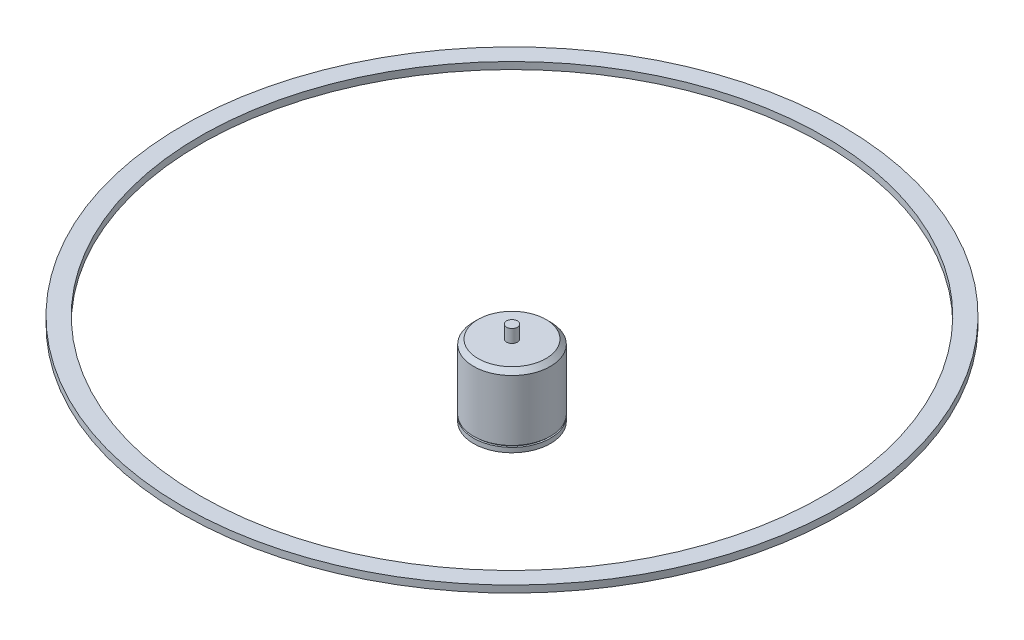
ISO-10303-21;
HEADER;
FILE_DESCRIPTION(('STEP AP214'),'2;1');
FILE_NAME('part.step','',(''),(''),'','','');
FILE_SCHEMA(('AUTOMOTIVE_DESIGN { 1 0 10303 214 1 1 1 1 }'));
ENDSEC;
DATA;
#1=APPLICATION_CONTEXT('core data for automotive mechanical design processes');
#2=APPLICATION_PROTOCOL_DEFINITION('international standard','automotive_design',2000,#1);
#3=PRODUCT_CONTEXT('',#1,'mechanical');
#4=PRODUCT('Part','Part','',(#3));
#5=PRODUCT_RELATED_PRODUCT_CATEGORY('part','',(#4));
#6=PRODUCT_DEFINITION_FORMATION('','',#4);
#7=PRODUCT_DEFINITION_CONTEXT('part definition',#1,'design');
#8=PRODUCT_DEFINITION('design','',#6,#7);
#9=PRODUCT_DEFINITION_SHAPE('','',#8);
#10=(LENGTH_UNIT() NAMED_UNIT(*) SI_UNIT(.MILLI.,.METRE.));
#11=(NAMED_UNIT(*) PLANE_ANGLE_UNIT() SI_UNIT($,.RADIAN.));
#12=(NAMED_UNIT(*) SI_UNIT($,.STERADIAN.) SOLID_ANGLE_UNIT());
#13=UNCERTAINTY_MEASURE_WITH_UNIT(LENGTH_MEASURE(1.E-05),#10,'distance_accuracy_value','');
#14=(GEOMETRIC_REPRESENTATION_CONTEXT(3) GLOBAL_UNCERTAINTY_ASSIGNED_CONTEXT((#13)) GLOBAL_UNIT_ASSIGNED_CONTEXT((#10,
#11,#12)) REPRESENTATION_CONTEXT('',''));
#15=CARTESIAN_POINT('',(0.,0.,0.));
#16=DIRECTION('',(0.,0.,1.));
#17=DIRECTION('',(1.,0.,0.));
#18=AXIS2_PLACEMENT_3D('',#15,#16,#17);
#19=CARTESIAN_POINT('',(0.,33.260506380273,0.));
#20=DIRECTION('',(0.,-1.,0.));
#21=DIRECTION('',(0.,0.,-1.));
#22=AXIS2_PLACEMENT_3D('',#19,#20,#21);
#23=CYLINDRICAL_SURFACE('',#22,113.503262110953);
#24=CARTESIAN_POINT('',(0.,33.260506380273,0.));
#25=DIRECTION('',(0.,1.,0.));
#26=DIRECTION('',(0.,0.,1.));
#27=AXIS2_PLACEMENT_3D('',#24,#25,#26);
#28=CIRCLE('',#27,113.503262110953);
#29=CARTESIAN_POINT('',(0.,33.260506380273,113.503262110953));
#30=VERTEX_POINT('',#29);
#31=EDGE_CURVE('E51',#30,#30,#28,.T.);
#32=ORIENTED_EDGE('',*,*,#31,.T.);
#33=EDGE_LOOP('',(#32));
#34=FACE_BOUND('',#33,.T.);
#35=CARTESIAN_POINT('',(0.,30.720506380273,0.));
#36=DIRECTION('',(0.,1.,0.));
#37=DIRECTION('',(0.,0.,1.));
#38=AXIS2_PLACEMENT_3D('',#35,#36,#37);
#39=CIRCLE('',#38,113.503262110953);
#40=CARTESIAN_POINT('',(0.,30.720506380273,113.503262110953));
#41=VERTEX_POINT('',#40);
#42=EDGE_CURVE('E57',#41,#41,#39,.T.);
#43=ORIENTED_EDGE('',*,*,#42,.F.);
#44=EDGE_LOOP('',(#43));
#45=FACE_BOUND('',#44,.T.);
#46=ADVANCED_FACE('F44',(#34,#45),#23,.F.);
#47=CARTESIAN_POINT('',(0.,33.260506380273,0.));
#48=DIRECTION('',(0.,-1.,0.));
#49=DIRECTION('',(0.,0.,-1.));
#50=AXIS2_PLACEMENT_3D('',#47,#48,#49);
#51=CYLINDRICAL_SURFACE('',#50,120.015);
#52=CARTESIAN_POINT('',(0.,33.260506380273,0.));
#53=DIRECTION('',(0.,1.,0.));
#54=DIRECTION('',(0.,0.,1.));
#55=AXIS2_PLACEMENT_3D('',#52,#53,#54);
#56=CIRCLE('',#55,120.015);
#57=CARTESIAN_POINT('',(0.,33.260506380273,120.015));
#58=VERTEX_POINT('',#57);
#59=EDGE_CURVE('E11',#58,#58,#56,.T.);
#60=ORIENTED_EDGE('',*,*,#59,.F.);
#61=EDGE_LOOP('',(#60));
#62=FACE_BOUND('',#61,.T.);
#63=CARTESIAN_POINT('',(0.,30.720506380273,0.));
#64=DIRECTION('',(0.,1.,0.));
#65=DIRECTION('',(0.,0.,1.));
#66=AXIS2_PLACEMENT_3D('',#63,#64,#65);
#67=CIRCLE('',#66,120.015);
#68=CARTESIAN_POINT('',(0.,30.720506380273,120.015));
#69=VERTEX_POINT('',#68);
#70=EDGE_CURVE('E47',#69,#69,#67,.T.);
#71=ORIENTED_EDGE('',*,*,#70,.T.);
#72=EDGE_LOOP('',(#71));
#73=FACE_BOUND('',#72,.T.);
#74=ADVANCED_FACE('F64',(#62,#73),#51,.T.);
#75=CARTESIAN_POINT('',(0.,33.260506380273,0.));
#76=DIRECTION('',(0.,1.,0.));
#77=DIRECTION('',(0.,0.,1.));
#78=AXIS2_PLACEMENT_3D('',#75,#76,#77);
#79=PLANE('',#78);
#80=ORIENTED_EDGE('',*,*,#31,.F.);
#81=EDGE_LOOP('',(#80));
#82=FACE_BOUND('',#81,.T.);
#83=ORIENTED_EDGE('',*,*,#59,.T.);
#84=EDGE_LOOP('',(#83));
#85=FACE_BOUND('',#84,.T.);
#86=ADVANCED_FACE('F68',(#82,#85),#79,.T.);
#87=CARTESIAN_POINT('',(0.,30.720506380273,0.));
#88=DIRECTION('',(0.,1.,0.));
#89=DIRECTION('',(0.,0.,1.));
#90=AXIS2_PLACEMENT_3D('',#87,#88,#89);
#91=PLANE('',#90);
#92=ORIENTED_EDGE('',*,*,#42,.T.);
#93=EDGE_LOOP('',(#92));
#94=FACE_BOUND('',#93,.T.);
#95=ORIENTED_EDGE('',*,*,#70,.F.);
#96=EDGE_LOOP('',(#95));
#97=FACE_BOUND('',#96,.T.);
#98=ADVANCED_FACE('F66',(#94,#97),#91,.F.);
#99=CLOSED_SHELL('',(#46,#74,#86,#98));
#100=MANIFOLD_SOLID_BREP('B2',#99);
#101=CARTESIAN_POINT('',(0.,0.,0.));
#102=DIRECTION('',(0.,1.,0.));
#103=DIRECTION('',(0.,0.,1.));
#104=AXIS2_PLACEMENT_3D('',#101,#102,#103);
#105=PLANE('',#104);
#106=CARTESIAN_POINT('',(0.,0.,0.));
#107=DIRECTION('',(0.,1.,0.));
#108=DIRECTION('',(0.,0.,1.));
#109=AXIS2_PLACEMENT_3D('',#106,#107,#108);
#110=CIRCLE('',#109,14.);
#111=CARTESIAN_POINT('',(0.,0.,14.));
#112=VERTEX_POINT('',#111);
#113=EDGE_CURVE('E43',#112,#112,#110,.T.);
#114=ORIENTED_EDGE('',*,*,#113,.F.);
#115=EDGE_LOOP('',(#114));
#116=FACE_BOUND('',#115,.T.);
#117=ADVANCED_FACE('F105',(#116),#105,.F.);
#118=CARTESIAN_POINT('',(0.,30.720506380273,0.));
#119=DIRECTION('',(0.,1.,0.));
#120=DIRECTION('',(0.,0.,1.));
#121=AXIS2_PLACEMENT_3D('',#118,#119,#120);
#122=CYLINDRICAL_SURFACE('',#121,14.);
#123=CARTESIAN_POINT('',(0.,1.71275302505127,0.));
#124=DIRECTION('',(0.,1.,0.));
#125=DIRECTION('',(0.,0.,1.));
#126=AXIS2_PLACEMENT_3D('',#123,#124,#125);
#127=CIRCLE('',#126,14.);
#128=CARTESIAN_POINT('',(0.,1.71275302505127,14.));
#129=VERTEX_POINT('',#128);
#130=EDGE_CURVE('E111',#129,#129,#127,.T.);
#131=ORIENTED_EDGE('',*,*,#130,.F.);
#132=EDGE_LOOP('',(#131));
#133=FACE_BOUND('',#132,.T.);
#134=ORIENTED_EDGE('',*,*,#113,.T.);
#135=EDGE_LOOP('',(#134));
#136=FACE_BOUND('',#135,.T.);
#137=ADVANCED_FACE('F180',(#133,#136),#122,.T.);
#138=CARTESIAN_POINT('',(14.,1.71275302505127,0.));
#139=DIRECTION('',(0.,-1.,0.));
#140=DIRECTION('',(0.,0.,-1.));
#141=AXIS2_PLACEMENT_3D('',#138,#139,#140);
#142=PLANE('',#141);
#143=CARTESIAN_POINT('',(0.,1.71275302505127,0.));
#144=DIRECTION('',(0.,1.,0.));
#145=DIRECTION('',(0.,0.,1.));
#146=AXIS2_PLACEMENT_3D('',#143,#144,#145);
#147=CIRCLE('',#146,13.3774301925298);
#148=CARTESIAN_POINT('',(0.,1.71275302505127,13.3774301925298));
#149=VERTEX_POINT('',#148);
#150=EDGE_CURVE('E115',#149,#149,#147,.T.);
#151=ORIENTED_EDGE('',*,*,#150,.F.);
#152=EDGE_LOOP('',(#151));
#153=FACE_BOUND('',#152,.T.);
#154=ORIENTED_EDGE('',*,*,#130,.T.);
#155=EDGE_LOOP('',(#154));
#156=FACE_BOUND('',#155,.T.);
#157=ADVANCED_FACE('F175',(#153,#156),#142,.F.);
#158=CARTESIAN_POINT('',(0.,30.720506380273,0.));
#159=DIRECTION('',(0.,1.,0.));
#160=DIRECTION('',(0.,0.,1.));
#161=AXIS2_PLACEMENT_3D('',#158,#159,#160);
#162=CYLINDRICAL_SURFACE('',#161,13.3774301925298);
#163=CARTESIAN_POINT('',(0.,2.3032847871112,0.));
#164=DIRECTION('',(0.,1.,0.));
#165=DIRECTION('',(0.,0.,1.));
#166=AXIS2_PLACEMENT_3D('',#163,#164,#165);
#167=CIRCLE('',#166,13.3774301925298);
#168=CARTESIAN_POINT('',(0.,2.3032847871112,13.3774301925298));
#169=VERTEX_POINT('',#168);
#170=EDGE_CURVE('E119',#169,#169,#167,.T.);
#171=ORIENTED_EDGE('',*,*,#170,.F.);
#172=EDGE_LOOP('',(#171));
#173=FACE_BOUND('',#172,.T.);
#174=ORIENTED_EDGE('',*,*,#150,.T.);
#175=EDGE_LOOP('',(#174));
#176=FACE_BOUND('',#175,.T.);
#177=ADVANCED_FACE('F169',(#173,#176),#162,.T.);
#178=CARTESIAN_POINT('',(13.3774301925298,2.3032847871112,0.));
#179=DIRECTION('',(0.,1.,0.));
#180=DIRECTION('',(0.,0.,1.));
#181=AXIS2_PLACEMENT_3D('',#178,#179,#180);
#182=PLANE('',#181);
#183=CARTESIAN_POINT('',(0.,2.3032847871112,0.));
#184=DIRECTION('',(0.,1.,0.));
#185=DIRECTION('',(0.,0.,1.));
#186=AXIS2_PLACEMENT_3D('',#183,#184,#185);
#187=CIRCLE('',#186,14.);
#188=CARTESIAN_POINT('',(0.,2.3032847871112,14.));
#189=VERTEX_POINT('',#188);
#190=EDGE_CURVE('E124',#189,#189,#187,.T.);
#191=ORIENTED_EDGE('',*,*,#190,.F.);
#192=EDGE_LOOP('',(#191));
#193=FACE_BOUND('',#192,.T.);
#194=ORIENTED_EDGE('',*,*,#170,.T.);
#195=EDGE_LOOP('',(#194));
#196=FACE_BOUND('',#195,.T.);
#197=ADVANCED_FACE('F163',(#193,#196),#182,.F.);
#198=CARTESIAN_POINT('',(0.,30.720506380273,0.));
#199=DIRECTION('',(0.,1.,0.));
#200=DIRECTION('',(0.,0.,1.));
#201=AXIS2_PLACEMENT_3D('',#198,#199,#200);
#202=CYLINDRICAL_SURFACE('',#201,14.);
#203=CARTESIAN_POINT('',(0.,24.3622244290961,0.));
#204=DIRECTION('',(0.,1.,0.));
#205=DIRECTION('',(0.,0.,1.));
#206=AXIS2_PLACEMENT_3D('',#203,#204,#205);
#207=CIRCLE('',#206,14.);
#208=CARTESIAN_POINT('',(0.,24.3622244290961,14.));
#209=VERTEX_POINT('',#208);
#210=EDGE_CURVE('E127',#209,#209,#207,.T.);
#211=ORIENTED_EDGE('',*,*,#210,.F.);
#212=EDGE_LOOP('',(#211));
#213=FACE_BOUND('',#212,.T.);
#214=ORIENTED_EDGE('',*,*,#190,.T.);
#215=EDGE_LOOP('',(#214));
#216=FACE_BOUND('',#215,.T.);
#217=ADVANCED_FACE('F157',(#213,#216),#202,.T.);
#218=CARTESIAN_POINT('',(0.,24.3622244290961,0.));
#219=DIRECTION('',(0.,-1.,0.));
#220=DIRECTION('',(0.,0.,-1.));
#221=AXIS2_PLACEMENT_3D('',#218,#219,#220);
#222=CONICAL_SURFACE('',#221,14.,0.785398163397453);
#223=CARTESIAN_POINT('',(0.,26.,0.));
#224=DIRECTION('',(0.,1.,0.));
#225=DIRECTION('',(0.,0.,1.));
#226=AXIS2_PLACEMENT_3D('',#223,#224,#225);
#227=CIRCLE('',#226,12.362224429096);
#228=CARTESIAN_POINT('',(0.,26.,12.362224429096));
#229=VERTEX_POINT('',#228);
#230=EDGE_CURVE('E130',#229,#229,#227,.T.);
#231=ORIENTED_EDGE('',*,*,#230,.F.);
#232=EDGE_LOOP('',(#231));
#233=FACE_BOUND('',#232,.T.);
#234=ORIENTED_EDGE('',*,*,#210,.T.);
#235=EDGE_LOOP('',(#234));
#236=FACE_BOUND('',#235,.T.);
#237=ADVANCED_FACE('F151',(#233,#236),#222,.T.);
#238=CARTESIAN_POINT('',(12.362224429096,26.,0.));
#239=DIRECTION('',(0.,-1.,0.));
#240=DIRECTION('',(0.,0.,-1.));
#241=AXIS2_PLACEMENT_3D('',#238,#239,#240);
#242=PLANE('',#241);
#243=CARTESIAN_POINT('',(0.,26.,0.));
#244=DIRECTION('',(0.,1.,0.));
#245=DIRECTION('',(0.,0.,1.));
#246=AXIS2_PLACEMENT_3D('',#243,#244,#245);
#247=CIRCLE('',#246,1.9950529099477);
#248=CARTESIAN_POINT('',(0.,26.,1.9950529099477));
#249=VERTEX_POINT('',#248);
#250=EDGE_CURVE('E133',#249,#249,#247,.T.);
#251=ORIENTED_EDGE('',*,*,#250,.F.);
#252=EDGE_LOOP('',(#251));
#253=FACE_BOUND('',#252,.T.);
#254=ORIENTED_EDGE('',*,*,#230,.T.);
#255=EDGE_LOOP('',(#254));
#256=FACE_BOUND('',#255,.T.);
#257=ADVANCED_FACE('F145',(#253,#256),#242,.F.);
#258=CARTESIAN_POINT('',(0.,30.720506380273,0.));
#259=DIRECTION('',(0.,1.,0.));
#260=DIRECTION('',(0.,0.,1.));
#261=AXIS2_PLACEMENT_3D('',#258,#259,#260);
#262=CYLINDRICAL_SURFACE('',#261,1.9950529099477);
#263=CARTESIAN_POINT('',(0.,30.720506380273,0.));
#264=DIRECTION('',(0.,1.,0.));
#265=DIRECTION('',(0.,0.,1.));
#266=AXIS2_PLACEMENT_3D('',#263,#264,#265);
#267=CIRCLE('',#266,1.9950529099477);
#268=CARTESIAN_POINT('',(0.,30.720506380273,1.9950529099477));
#269=VERTEX_POINT('',#268);
#270=EDGE_CURVE('E136',#269,#269,#267,.T.);
#271=ORIENTED_EDGE('',*,*,#270,.F.);
#272=EDGE_LOOP('',(#271));
#273=FACE_BOUND('',#272,.T.);
#274=ORIENTED_EDGE('',*,*,#250,.T.);
#275=EDGE_LOOP('',(#274));
#276=FACE_BOUND('',#275,.T.);
#277=ADVANCED_FACE('F142',(#273,#276),#262,.T.);
#278=CARTESIAN_POINT('',(1.9950529099477,30.720506380273,0.));
#279=DIRECTION('',(0.,-1.,0.));
#280=DIRECTION('',(0.,0.,-1.));
#281=AXIS2_PLACEMENT_3D('',#278,#279,#280);
#282=PLANE('',#281);
#283=ORIENTED_EDGE('',*,*,#270,.T.);
#284=EDGE_LOOP('',(#283));
#285=FACE_BOUND('',#284,.T.);
#286=ADVANCED_FACE('F140',(#285),#282,.F.);
#287=CLOSED_SHELL('',(#117,#137,#157,#177,#197,#217,#237,#257,#277,#286));
#288=MANIFOLD_SOLID_BREP('B6',#287);
#289=ADVANCED_BREP_SHAPE_REPRESENTATION('',(#18,#100,#288),#14);
#290=SHAPE_DEFINITION_REPRESENTATION(#9,#289);
ENDSEC;
END-ISO-10303-21;
